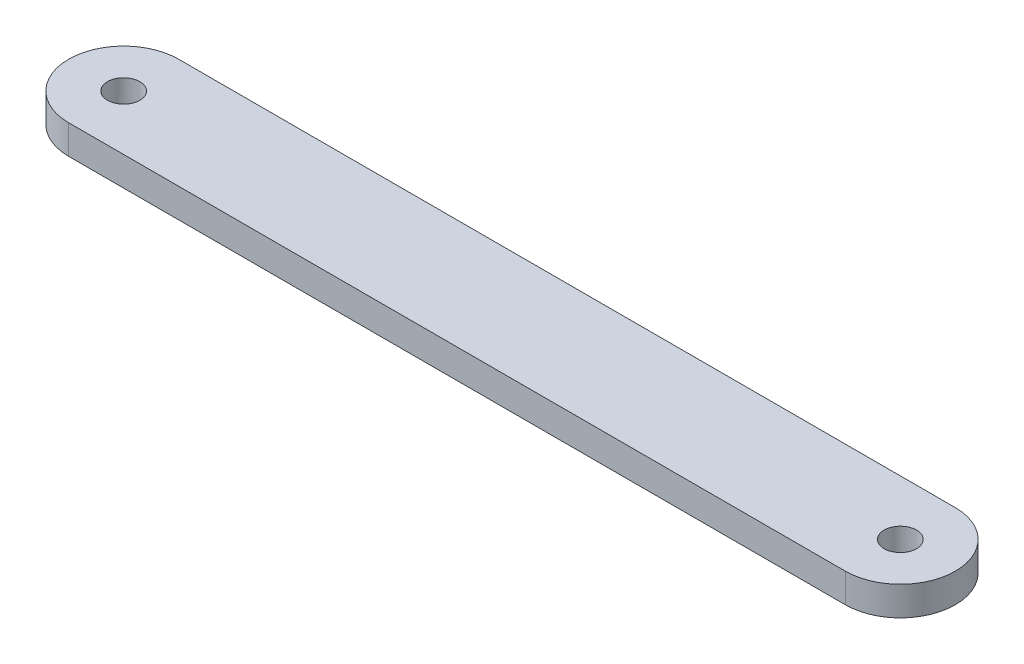
ISO-10303-21;
HEADER;
FILE_DESCRIPTION(('STEP AP214'),'2;1');
FILE_NAME('part.step','',(''),(''),'','','');
FILE_SCHEMA(('AUTOMOTIVE_DESIGN { 1 0 10303 214 1 1 1 1 }'));
ENDSEC;
DATA;
#1=APPLICATION_CONTEXT('core data for automotive mechanical design processes');
#2=APPLICATION_PROTOCOL_DEFINITION('international standard','automotive_design',2000,#1);
#3=PRODUCT_CONTEXT('',#1,'mechanical');
#4=PRODUCT('Part','Part','',(#3));
#5=PRODUCT_RELATED_PRODUCT_CATEGORY('part','',(#4));
#6=PRODUCT_DEFINITION_FORMATION('','',#4);
#7=PRODUCT_DEFINITION_CONTEXT('part definition',#1,'design');
#8=PRODUCT_DEFINITION('design','',#6,#7);
#9=PRODUCT_DEFINITION_SHAPE('','',#8);
#10=(LENGTH_UNIT() NAMED_UNIT(*) SI_UNIT(.MILLI.,.METRE.));
#11=(NAMED_UNIT(*) PLANE_ANGLE_UNIT() SI_UNIT($,.RADIAN.));
#12=(NAMED_UNIT(*) SI_UNIT($,.STERADIAN.) SOLID_ANGLE_UNIT());
#13=UNCERTAINTY_MEASURE_WITH_UNIT(LENGTH_MEASURE(1.E-05),#10,'distance_accuracy_value','');
#14=(GEOMETRIC_REPRESENTATION_CONTEXT(3) GLOBAL_UNCERTAINTY_ASSIGNED_CONTEXT((#13)) GLOBAL_UNIT_ASSIGNED_CONTEXT((#10,
#11,#12)) REPRESENTATION_CONTEXT('',''));
#15=CARTESIAN_POINT('',(0.,0.,0.));
#16=DIRECTION('',(0.,0.,1.));
#17=DIRECTION('',(1.,0.,0.));
#18=AXIS2_PLACEMENT_3D('',#15,#16,#17);
#19=CARTESIAN_POINT('',(0.,4.5,-8.5));
#20=DIRECTION('',(0.,0.,-1.));
#21=DIRECTION('',(-1.,0.,0.));
#22=AXIS2_PLACEMENT_3D('',#19,#20,#21);
#23=PLANE('',#22);
#24=DIRECTION('',(1.,0.,0.));
#25=VECTOR('',#24,1.);
#26=CARTESIAN_POINT('',(0.,0.,-8.5));
#27=LINE('',#26,#25);
#28=CARTESIAN_POINT('',(-120.,0.,-8.5));
#29=VERTEX_POINT('',#28);
#30=CARTESIAN_POINT('',(0.,0.,-8.5));
#31=VERTEX_POINT('',#30);
#32=EDGE_CURVE('E117',#29,#31,#27,.T.);
#33=ORIENTED_EDGE('',*,*,#32,.F.);
#34=DIRECTION('',(0.,-1.,0.));
#35=VECTOR('',#34,1.);
#36=CARTESIAN_POINT('',(-120.,4.5,-8.5));
#37=LINE('',#36,#35);
#38=CARTESIAN_POINT('',(-120.,4.5,-8.5));
#39=VERTEX_POINT('',#38);
#40=EDGE_CURVE('E11',#39,#29,#37,.T.);
#41=ORIENTED_EDGE('',*,*,#40,.F.);
#42=DIRECTION('',(1.,0.,0.));
#43=VECTOR('',#42,1.);
#44=CARTESIAN_POINT('',(0.,4.5,-8.5));
#45=LINE('',#44,#43);
#46=CARTESIAN_POINT('',(0.,4.5,-8.5));
#47=VERTEX_POINT('',#46);
#48=EDGE_CURVE('E93',#39,#47,#45,.T.);
#49=ORIENTED_EDGE('',*,*,#48,.T.);
#50=DIRECTION('',(0.,-1.,0.));
#51=VECTOR('',#50,1.);
#52=CARTESIAN_POINT('',(0.,4.5,-8.5));
#53=LINE('',#52,#51);
#54=EDGE_CURVE('E81',#47,#31,#53,.T.);
#55=ORIENTED_EDGE('',*,*,#54,.T.);
#56=EDGE_LOOP('',(#33,#41,#49,#55));
#57=FACE_BOUND('',#56,.T.);
#58=ADVANCED_FACE('F41',(#57),#23,.T.);
#59=CARTESIAN_POINT('',(-120.,4.5,0.));
#60=DIRECTION('',(0.,-1.,0.));
#61=DIRECTION('',(0.,0.,-1.));
#62=AXIS2_PLACEMENT_3D('',#59,#60,#61);
#63=CYLINDRICAL_SURFACE('',#62,8.5);
#64=CARTESIAN_POINT('',(-120.,0.,0.));
#65=DIRECTION('',(0.,1.,0.));
#66=DIRECTION('',(0.,0.,1.));
#67=AXIS2_PLACEMENT_3D('',#64,#65,#66);
#68=CIRCLE('',#67,8.5);
#69=CARTESIAN_POINT('',(-120.,0.,8.5));
#70=VERTEX_POINT('',#69);
#71=EDGE_CURVE('E99',#29,#70,#68,.T.);
#72=ORIENTED_EDGE('',*,*,#71,.T.);
#73=DIRECTION('',(0.,-1.,0.));
#74=VECTOR('',#73,1.);
#75=CARTESIAN_POINT('',(-120.,4.5,8.5));
#76=LINE('',#75,#74);
#77=CARTESIAN_POINT('',(-120.,4.5,8.5));
#78=VERTEX_POINT('',#77);
#79=EDGE_CURVE('E50',#78,#70,#76,.T.);
#80=ORIENTED_EDGE('',*,*,#79,.F.);
#81=CARTESIAN_POINT('',(-120.,4.5,0.));
#82=DIRECTION('',(0.,1.,0.));
#83=DIRECTION('',(0.,0.,1.));
#84=AXIS2_PLACEMENT_3D('',#81,#82,#83);
#85=CIRCLE('',#84,8.5);
#86=EDGE_CURVE('E87',#39,#78,#85,.T.);
#87=ORIENTED_EDGE('',*,*,#86,.F.);
#88=ORIENTED_EDGE('',*,*,#40,.T.);
#89=EDGE_LOOP('',(#72,#80,#87,#88));
#90=FACE_BOUND('',#89,.T.);
#91=ADVANCED_FACE('F97',(#90),#63,.T.);
#92=CARTESIAN_POINT('',(0.,4.5,8.5));
#93=DIRECTION('',(0.,0.,-1.));
#94=DIRECTION('',(-1.,0.,0.));
#95=AXIS2_PLACEMENT_3D('',#92,#93,#94);
#96=PLANE('',#95);
#97=DIRECTION('',(1.,0.,0.));
#98=VECTOR('',#97,1.);
#99=CARTESIAN_POINT('',(0.,0.,8.5));
#100=LINE('',#99,#98);
#101=CARTESIAN_POINT('',(0.,0.,8.5));
#102=VERTEX_POINT('',#101);
#103=EDGE_CURVE('E74',#70,#102,#100,.T.);
#104=ORIENTED_EDGE('',*,*,#103,.T.);
#105=DIRECTION('',(0.,-1.,0.));
#106=VECTOR('',#105,1.);
#107=CARTESIAN_POINT('',(0.,4.5,8.5));
#108=LINE('',#107,#106);
#109=CARTESIAN_POINT('',(0.,4.5,8.5));
#110=VERTEX_POINT('',#109);
#111=EDGE_CURVE('E101',#110,#102,#108,.T.);
#112=ORIENTED_EDGE('',*,*,#111,.F.);
#113=DIRECTION('',(1.,0.,0.));
#114=VECTOR('',#113,1.);
#115=CARTESIAN_POINT('',(0.,4.5,8.5));
#116=LINE('',#115,#114);
#117=EDGE_CURVE('E92',#78,#110,#116,.T.);
#118=ORIENTED_EDGE('',*,*,#117,.F.);
#119=ORIENTED_EDGE('',*,*,#79,.T.);
#120=EDGE_LOOP('',(#104,#112,#118,#119));
#121=FACE_BOUND('',#120,.T.);
#122=ADVANCED_FACE('F102',(#121),#96,.F.);
#123=CARTESIAN_POINT('',(0.,4.5,0.));
#124=DIRECTION('',(0.,-1.,0.));
#125=DIRECTION('',(0.,0.,-1.));
#126=AXIS2_PLACEMENT_3D('',#123,#124,#125);
#127=CYLINDRICAL_SURFACE('',#126,2.5);
#128=CARTESIAN_POINT('',(0.,4.5,0.));
#129=DIRECTION('',(0.,1.,0.));
#130=DIRECTION('',(0.,0.,1.));
#131=AXIS2_PLACEMENT_3D('',#128,#129,#130);
#132=CIRCLE('',#131,2.5);
#133=CARTESIAN_POINT('',(0.,4.5,2.5));
#134=VERTEX_POINT('',#133);
#135=EDGE_CURVE('E106',#134,#134,#132,.T.);
#136=ORIENTED_EDGE('',*,*,#135,.T.);
#137=EDGE_LOOP('',(#136));
#138=FACE_BOUND('',#137,.T.);
#139=CARTESIAN_POINT('',(0.,0.,0.));
#140=DIRECTION('',(0.,1.,0.));
#141=DIRECTION('',(0.,0.,1.));
#142=AXIS2_PLACEMENT_3D('',#139,#140,#141);
#143=CIRCLE('',#142,2.5);
#144=CARTESIAN_POINT('',(0.,0.,2.5));
#145=VERTEX_POINT('',#144);
#146=EDGE_CURVE('E128',#145,#145,#143,.T.);
#147=ORIENTED_EDGE('',*,*,#146,.F.);
#148=EDGE_LOOP('',(#147));
#149=FACE_BOUND('',#148,.T.);
#150=ADVANCED_FACE('F152',(#138,#149),#127,.F.);
#151=CARTESIAN_POINT('',(0.,4.5,0.));
#152=DIRECTION('',(0.,-1.,0.));
#153=DIRECTION('',(0.,0.,-1.));
#154=AXIS2_PLACEMENT_3D('',#151,#152,#153);
#155=CYLINDRICAL_SURFACE('',#154,8.5);
#156=CARTESIAN_POINT('',(0.,0.,0.));
#157=DIRECTION('',(0.,1.,0.));
#158=DIRECTION('',(0.,0.,1.));
#159=AXIS2_PLACEMENT_3D('',#156,#157,#158);
#160=CIRCLE('',#159,8.5);
#161=EDGE_CURVE('E125',#102,#31,#160,.T.);
#162=ORIENTED_EDGE('',*,*,#161,.T.);
#163=ORIENTED_EDGE('',*,*,#54,.F.);
#164=CARTESIAN_POINT('',(0.,4.5,0.));
#165=DIRECTION('',(0.,1.,0.));
#166=DIRECTION('',(0.,0.,1.));
#167=AXIS2_PLACEMENT_3D('',#164,#165,#166);
#168=CIRCLE('',#167,8.5);
#169=EDGE_CURVE('E58',#110,#47,#168,.T.);
#170=ORIENTED_EDGE('',*,*,#169,.F.);
#171=ORIENTED_EDGE('',*,*,#111,.T.);
#172=EDGE_LOOP('',(#162,#163,#170,#171));
#173=FACE_BOUND('',#172,.T.);
#174=ADVANCED_FACE('F141',(#173),#155,.T.);
#175=CARTESIAN_POINT('',(-120.,4.5,0.));
#176=DIRECTION('',(0.,-1.,0.));
#177=DIRECTION('',(0.,0.,-1.));
#178=AXIS2_PLACEMENT_3D('',#175,#176,#177);
#179=CYLINDRICAL_SURFACE('',#178,2.49999999999999);
#180=CARTESIAN_POINT('',(-120.,4.5,0.));
#181=DIRECTION('',(0.,1.,0.));
#182=DIRECTION('',(0.,0.,1.));
#183=AXIS2_PLACEMENT_3D('',#180,#181,#182);
#184=CIRCLE('',#183,2.49999999999999);
#185=CARTESIAN_POINT('',(-120.,4.5,2.49999999999999));
#186=VERTEX_POINT('',#185);
#187=EDGE_CURVE('E113',#186,#186,#184,.T.);
#188=ORIENTED_EDGE('',*,*,#187,.T.);
#189=EDGE_LOOP('',(#188));
#190=FACE_BOUND('',#189,.T.);
#191=CARTESIAN_POINT('',(-120.,0.,0.));
#192=DIRECTION('',(0.,1.,0.));
#193=DIRECTION('',(0.,0.,1.));
#194=AXIS2_PLACEMENT_3D('',#191,#192,#193);
#195=CIRCLE('',#194,2.49999999999999);
#196=CARTESIAN_POINT('',(-120.,0.,2.49999999999999));
#197=VERTEX_POINT('',#196);
#198=EDGE_CURVE('E132',#197,#197,#195,.T.);
#199=ORIENTED_EDGE('',*,*,#198,.F.);
#200=EDGE_LOOP('',(#199));
#201=FACE_BOUND('',#200,.T.);
#202=ADVANCED_FACE('F157',(#190,#201),#179,.F.);
#203=CARTESIAN_POINT('',(0.,4.5,0.));
#204=DIRECTION('',(0.,1.,0.));
#205=DIRECTION('',(0.,0.,1.));
#206=AXIS2_PLACEMENT_3D('',#203,#204,#205);
#207=PLANE('',#206);
#208=ORIENTED_EDGE('',*,*,#48,.F.);
#209=ORIENTED_EDGE('',*,*,#86,.T.);
#210=ORIENTED_EDGE('',*,*,#117,.T.);
#211=ORIENTED_EDGE('',*,*,#169,.T.);
#212=EDGE_LOOP('',(#208,#209,#210,#211));
#213=FACE_BOUND('',#212,.T.);
#214=ORIENTED_EDGE('',*,*,#135,.F.);
#215=EDGE_LOOP('',(#214));
#216=FACE_BOUND('',#215,.T.);
#217=ORIENTED_EDGE('',*,*,#187,.F.);
#218=EDGE_LOOP('',(#217));
#219=FACE_BOUND('',#218,.T.);
#220=ADVANCED_FACE('F89',(#213,#216,#219),#207,.T.);
#221=CARTESIAN_POINT('',(0.,0.,0.));
#222=DIRECTION('',(0.,1.,0.));
#223=DIRECTION('',(0.,0.,1.));
#224=AXIS2_PLACEMENT_3D('',#221,#222,#223);
#225=PLANE('',#224);
#226=ORIENTED_EDGE('',*,*,#32,.T.);
#227=ORIENTED_EDGE('',*,*,#161,.F.);
#228=ORIENTED_EDGE('',*,*,#103,.F.);
#229=ORIENTED_EDGE('',*,*,#71,.F.);
#230=EDGE_LOOP('',(#226,#227,#228,#229));
#231=FACE_BOUND('',#230,.T.);
#232=ORIENTED_EDGE('',*,*,#146,.T.);
#233=EDGE_LOOP('',(#232));
#234=FACE_BOUND('',#233,.T.);
#235=ORIENTED_EDGE('',*,*,#198,.T.);
#236=EDGE_LOOP('',(#235));
#237=FACE_BOUND('',#236,.T.);
#238=ADVANCED_FACE('F143',(#231,#234,#237),#225,.F.);
#239=CLOSED_SHELL('',(#58,#91,#122,#150,#174,#202,#220,#238));
#240=MANIFOLD_SOLID_BREP('B2',#239);
#241=ADVANCED_BREP_SHAPE_REPRESENTATION('',(#18,#240),#14);
#242=SHAPE_DEFINITION_REPRESENTATION(#9,#241);
ENDSEC;
END-ISO-10303-21;
